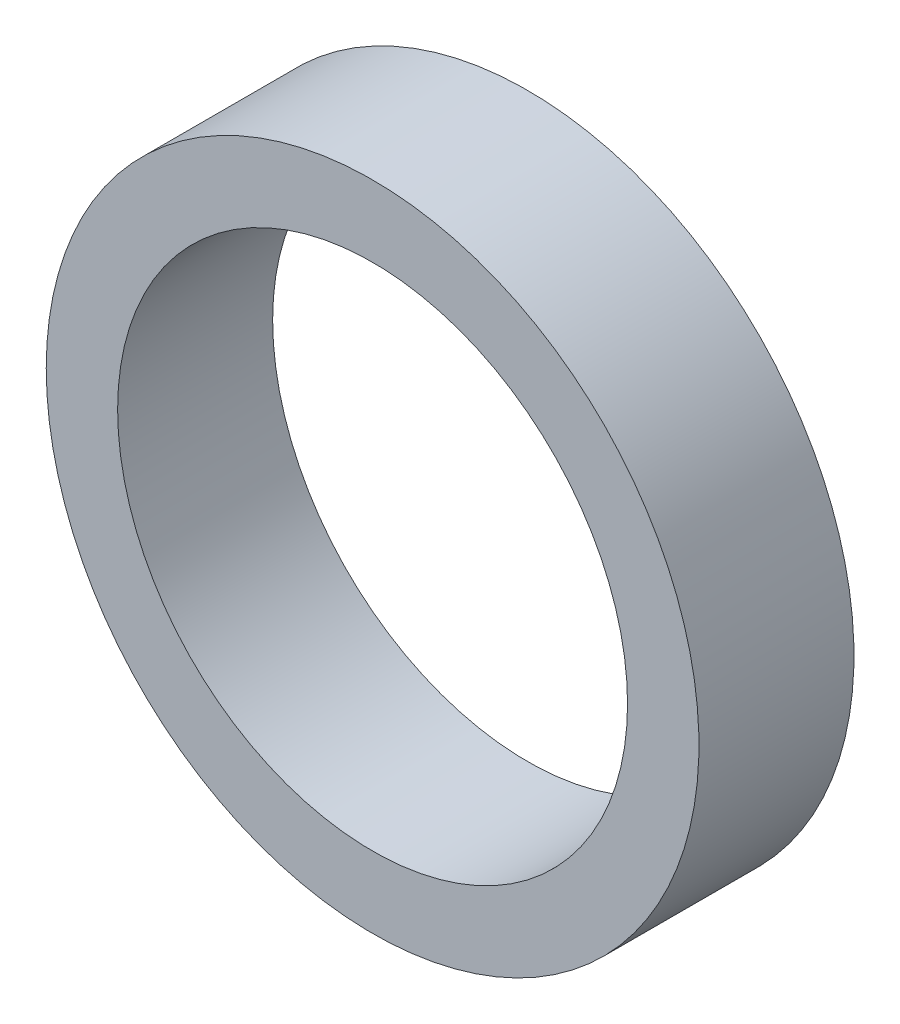
ISO-10303-21;
HEADER;
FILE_DESCRIPTION(('STEP AP214'),'2;1');
FILE_NAME('part.step','',(''),(''),'','','');
FILE_SCHEMA(('AUTOMOTIVE_DESIGN { 1 0 10303 214 1 1 1 1 }'));
ENDSEC;
DATA;
#1=APPLICATION_CONTEXT('core data for automotive mechanical design processes');
#2=APPLICATION_PROTOCOL_DEFINITION('international standard','automotive_design',2000,#1);
#3=PRODUCT_CONTEXT('',#1,'mechanical');
#4=PRODUCT('Part','Part','',(#3));
#5=PRODUCT_RELATED_PRODUCT_CATEGORY('part','',(#4));
#6=PRODUCT_DEFINITION_FORMATION('','',#4);
#7=PRODUCT_DEFINITION_CONTEXT('part definition',#1,'design');
#8=PRODUCT_DEFINITION('design','',#6,#7);
#9=PRODUCT_DEFINITION_SHAPE('','',#8);
#10=(LENGTH_UNIT() NAMED_UNIT(*) SI_UNIT(.MILLI.,.METRE.));
#11=(NAMED_UNIT(*) PLANE_ANGLE_UNIT() SI_UNIT($,.RADIAN.));
#12=(NAMED_UNIT(*) SI_UNIT($,.STERADIAN.) SOLID_ANGLE_UNIT());
#13=UNCERTAINTY_MEASURE_WITH_UNIT(LENGTH_MEASURE(1.E-05),#10,'distance_accuracy_value','');
#14=(GEOMETRIC_REPRESENTATION_CONTEXT(3) GLOBAL_UNCERTAINTY_ASSIGNED_CONTEXT((#13)) GLOBAL_UNIT_ASSIGNED_CONTEXT((#10,
#11,#12)) REPRESENTATION_CONTEXT('',''));
#15=CARTESIAN_POINT('',(0.,0.,0.));
#16=DIRECTION('',(0.,0.,1.));
#17=DIRECTION('',(1.,0.,0.));
#18=AXIS2_PLACEMENT_3D('',#15,#16,#17);
#19=CARTESIAN_POINT('',(0.,0.,7.6));
#20=DIRECTION('',(0.,0.,1.));
#21=DIRECTION('',(1.,0.,0.));
#22=AXIS2_PLACEMENT_3D('',#19,#20,#21);
#23=PLANE('',#22);
#24=CARTESIAN_POINT('',(0.,0.,7.6));
#25=DIRECTION('',(0.,0.,1.));
#26=DIRECTION('',(1.,0.,0.));
#27=AXIS2_PLACEMENT_3D('',#24,#25,#26);
#28=CIRCLE('',#27,16.);
#29=CARTESIAN_POINT('',(-16.,0.,7.6));
#30=VERTEX_POINT('',#29);
#31=EDGE_CURVE('E10',#30,#30,#28,.T.);
#32=ORIENTED_EDGE('',*,*,#31,.T.);
#33=EDGE_LOOP('',(#32));
#34=FACE_BOUND('',#33,.T.);
#35=CARTESIAN_POINT('',(0.,0.,7.6));
#36=DIRECTION('',(0.,0.,1.));
#37=DIRECTION('',(1.,0.,0.));
#38=AXIS2_PLACEMENT_3D('',#35,#36,#37);
#39=CIRCLE('',#38,12.5);
#40=CARTESIAN_POINT('',(-12.5,0.,7.6));
#41=VERTEX_POINT('',#40);
#42=EDGE_CURVE('E43',#41,#41,#39,.T.);
#43=ORIENTED_EDGE('',*,*,#42,.F.);
#44=EDGE_LOOP('',(#43));
#45=FACE_BOUND('',#44,.T.);
#46=ADVANCED_FACE('F32',(#34,#45),#23,.T.);
#47=CARTESIAN_POINT('',(0.,0.,0.));
#48=DIRECTION('',(0.,0.,1.));
#49=DIRECTION('',(1.,0.,0.));
#50=AXIS2_PLACEMENT_3D('',#47,#48,#49);
#51=PLANE('',#50);
#52=CARTESIAN_POINT('',(0.,0.,0.));
#53=DIRECTION('',(0.,0.,1.));
#54=DIRECTION('',(1.,0.,0.));
#55=AXIS2_PLACEMENT_3D('',#52,#53,#54);
#56=CIRCLE('',#55,16.);
#57=CARTESIAN_POINT('',(-16.,0.,0.));
#58=VERTEX_POINT('',#57);
#59=EDGE_CURVE('E36',#58,#58,#56,.T.);
#60=ORIENTED_EDGE('',*,*,#59,.F.);
#61=EDGE_LOOP('',(#60));
#62=FACE_BOUND('',#61,.T.);
#63=CARTESIAN_POINT('',(0.,0.,0.));
#64=DIRECTION('',(0.,0.,1.));
#65=DIRECTION('',(1.,0.,0.));
#66=AXIS2_PLACEMENT_3D('',#63,#64,#65);
#67=CIRCLE('',#66,12.5);
#68=CARTESIAN_POINT('',(-12.5,0.,0.));
#69=VERTEX_POINT('',#68);
#70=EDGE_CURVE('E45',#69,#69,#67,.T.);
#71=ORIENTED_EDGE('',*,*,#70,.T.);
#72=EDGE_LOOP('',(#71));
#73=FACE_BOUND('',#72,.T.);
#74=ADVANCED_FACE('F55',(#62,#73),#51,.F.);
#75=CARTESIAN_POINT('',(0.,0.,7.6));
#76=DIRECTION('',(0.,0.,-1.));
#77=DIRECTION('',(-1.,0.,0.));
#78=AXIS2_PLACEMENT_3D('',#75,#76,#77);
#79=CYLINDRICAL_SURFACE('',#78,16.);
#80=CARTESIAN_POINT('',(-16.,0.,7.6));
#81=CARTESIAN_POINT('',(-16.,0.,7.52083333333333));
#82=CARTESIAN_POINT('',(-16.,0.,7.44166666666667));
#83=CARTESIAN_POINT('',(-16.,0.,7.28333333333333));
#84=CARTESIAN_POINT('',(-16.,0.,7.20416666666667));
#85=CARTESIAN_POINT('',(-16.,0.,7.04583333333333));
#86=CARTESIAN_POINT('',(-16.,0.,6.96666666666667));
#87=CARTESIAN_POINT('',(-16.,0.,6.80833333333333));
#88=CARTESIAN_POINT('',(-16.,0.,6.72916666666667));
#89=CARTESIAN_POINT('',(-16.,0.,6.57083333333333));
#90=CARTESIAN_POINT('',(-16.,0.,6.49166666666667));
#91=CARTESIAN_POINT('',(-16.,0.,6.33333333333333));
#92=CARTESIAN_POINT('',(-16.,0.,6.25416666666667));
#93=CARTESIAN_POINT('',(-16.,0.,6.09583333333333));
#94=CARTESIAN_POINT('',(-16.,0.,6.01666666666667));
#95=CARTESIAN_POINT('',(-16.,0.,5.85833333333333));
#96=CARTESIAN_POINT('',(-16.,0.,5.77916666666667));
#97=CARTESIAN_POINT('',(-16.,0.,5.62083333333333));
#98=CARTESIAN_POINT('',(-16.,0.,5.54166666666667));
#99=CARTESIAN_POINT('',(-16.,0.,5.38333333333333));
#100=CARTESIAN_POINT('',(-16.,0.,5.30416666666667));
#101=CARTESIAN_POINT('',(-16.,0.,5.14583333333333));
#102=CARTESIAN_POINT('',(-16.,0.,5.06666666666667));
#103=CARTESIAN_POINT('',(-16.,0.,4.90833333333333));
#104=CARTESIAN_POINT('',(-16.,0.,4.82916666666667));
#105=CARTESIAN_POINT('',(-16.,0.,4.67083333333333));
#106=CARTESIAN_POINT('',(-16.,0.,4.59166666666667));
#107=CARTESIAN_POINT('',(-16.,0.,4.43333333333333));
#108=CARTESIAN_POINT('',(-16.,0.,4.35416666666667));
#109=CARTESIAN_POINT('',(-16.,0.,4.19583333333333));
#110=CARTESIAN_POINT('',(-16.,0.,4.11666666666667));
#111=CARTESIAN_POINT('',(-16.,0.,3.95833333333333));
#112=CARTESIAN_POINT('',(-16.,0.,3.87916666666667));
#113=CARTESIAN_POINT('',(-16.,0.,3.72083333333333));
#114=CARTESIAN_POINT('',(-16.,0.,3.64166666666667));
#115=CARTESIAN_POINT('',(-16.,0.,3.48333333333333));
#116=CARTESIAN_POINT('',(-16.,0.,3.40416666666667));
#117=CARTESIAN_POINT('',(-16.,0.,3.24583333333333));
#118=CARTESIAN_POINT('',(-16.,0.,3.16666666666667));
#119=CARTESIAN_POINT('',(-16.,0.,3.00833333333333));
#120=CARTESIAN_POINT('',(-16.,0.,2.92916666666667));
#121=CARTESIAN_POINT('',(-16.,0.,2.77083333333333));
#122=CARTESIAN_POINT('',(-16.,0.,2.69166666666667));
#123=CARTESIAN_POINT('',(-16.,0.,2.53333333333333));
#124=CARTESIAN_POINT('',(-16.,0.,2.45416666666667));
#125=CARTESIAN_POINT('',(-16.,0.,2.29583333333333));
#126=CARTESIAN_POINT('',(-16.,0.,2.21666666666667));
#127=CARTESIAN_POINT('',(-16.,0.,2.05833333333333));
#128=CARTESIAN_POINT('',(-16.,0.,1.97916666666667));
#129=CARTESIAN_POINT('',(-16.,0.,1.82083333333333));
#130=CARTESIAN_POINT('',(-16.,0.,1.74166666666667));
#131=CARTESIAN_POINT('',(-16.,0.,1.58333333333333));
#132=CARTESIAN_POINT('',(-16.,0.,1.50416666666667));
#133=CARTESIAN_POINT('',(-16.,0.,1.34583333333333));
#134=CARTESIAN_POINT('',(-16.,0.,1.26666666666667));
#135=CARTESIAN_POINT('',(-16.,0.,1.10833333333333));
#136=CARTESIAN_POINT('',(-16.,0.,1.02916666666667));
#137=CARTESIAN_POINT('',(-16.,0.,0.870833333333333));
#138=CARTESIAN_POINT('',(-16.,0.,0.791666666666667));
#139=CARTESIAN_POINT('',(-16.,0.,0.633333333333333));
#140=CARTESIAN_POINT('',(-16.,0.,0.554166666666666));
#141=CARTESIAN_POINT('',(-16.,0.,0.395833333333333));
#142=CARTESIAN_POINT('',(-16.,0.,0.316666666666667));
#143=CARTESIAN_POINT('',(-16.,0.,0.158333333333333));
#144=CARTESIAN_POINT('',(-16.,0.,0.0791666666666665));
#145=CARTESIAN_POINT('',(-16.,0.,0.));
#146=B_SPLINE_CURVE_WITH_KNOTS('',3,(#80,#81,#82,#83,#84,#85,#86,#87,#88,#89,#90,#91,#92,#93,
#94,#95,#96,#97,#98,#99,#100,#101,#102,#103,#104,#105,#106,#107,#108,#109,#110,#111,#112,#113,
#114,#115,#116,#117,#118,#119,#120,#121,#122,#123,#124,#125,#126,#127,#128,#129,#130,#131,#132,
#133,#134,#135,#136,#137,#138,#139,#140,#141,#142,#143,#144,#145),.UNSPECIFIED.,.F.,.F.,(4,2,2,
2,2,2,2,2,2,2,2,2,2,2,2,2,2,2,2,2,2,2,2,2,2,2,2,2,2,2,2,2,4),(0.,0.2375,0.475,0.7125,0.95,
1.1875,1.425,1.6625,1.9,2.1375,2.375,2.6125,2.85,3.0875,3.325,3.5625,3.8,4.0375,4.275,4.5125,
4.75,4.9875,5.225,5.4625,5.7,5.9375,6.175,6.4125,6.65,6.8875,7.125,7.3625,7.6),.UNSPECIFIED.);
#147=EDGE_CURVE('BSEAM34',#30,#58,#146,.T.);
#148=ORIENTED_EDGE('',*,*,#31,.F.);
#149=ORIENTED_EDGE('',*,*,#59,.T.);
#150=ORIENTED_EDGE('',*,*,#147,.T.);
#151=ORIENTED_EDGE('',*,*,#147,.F.);
#152=EDGE_LOOP('',(#148,#150,#149,#151));
#153=FACE_BOUND('',#152,.T.);
#154=ADVANCED_FACE('F34',(#153),#79,.T.);
#155=CARTESIAN_POINT('',(0.,0.,7.6));
#156=DIRECTION('',(0.,0.,-1.));
#157=DIRECTION('',(-1.,0.,0.));
#158=AXIS2_PLACEMENT_3D('',#155,#156,#157);
#159=CYLINDRICAL_SURFACE('',#158,12.5);
#160=CARTESIAN_POINT('',(-12.5,0.,7.6));
#161=CARTESIAN_POINT('',(-12.5,0.,7.52083333333333));
#162=CARTESIAN_POINT('',(-12.5,0.,7.44166666666667));
#163=CARTESIAN_POINT('',(-12.5,0.,7.28333333333333));
#164=CARTESIAN_POINT('',(-12.5,0.,7.20416666666667));
#165=CARTESIAN_POINT('',(-12.5,0.,7.04583333333333));
#166=CARTESIAN_POINT('',(-12.5,0.,6.96666666666667));
#167=CARTESIAN_POINT('',(-12.5,0.,6.80833333333333));
#168=CARTESIAN_POINT('',(-12.5,0.,6.72916666666667));
#169=CARTESIAN_POINT('',(-12.5,0.,6.57083333333333));
#170=CARTESIAN_POINT('',(-12.5,0.,6.49166666666667));
#171=CARTESIAN_POINT('',(-12.5,0.,6.33333333333333));
#172=CARTESIAN_POINT('',(-12.5,0.,6.25416666666667));
#173=CARTESIAN_POINT('',(-12.5,0.,6.09583333333333));
#174=CARTESIAN_POINT('',(-12.5,0.,6.01666666666667));
#175=CARTESIAN_POINT('',(-12.5,0.,5.85833333333333));
#176=CARTESIAN_POINT('',(-12.5,0.,5.77916666666667));
#177=CARTESIAN_POINT('',(-12.5,0.,5.62083333333333));
#178=CARTESIAN_POINT('',(-12.5,0.,5.54166666666667));
#179=CARTESIAN_POINT('',(-12.5,0.,5.38333333333333));
#180=CARTESIAN_POINT('',(-12.5,0.,5.30416666666667));
#181=CARTESIAN_POINT('',(-12.5,0.,5.14583333333333));
#182=CARTESIAN_POINT('',(-12.5,0.,5.06666666666667));
#183=CARTESIAN_POINT('',(-12.5,0.,4.90833333333333));
#184=CARTESIAN_POINT('',(-12.5,0.,4.82916666666667));
#185=CARTESIAN_POINT('',(-12.5,0.,4.67083333333333));
#186=CARTESIAN_POINT('',(-12.5,0.,4.59166666666667));
#187=CARTESIAN_POINT('',(-12.5,0.,4.43333333333333));
#188=CARTESIAN_POINT('',(-12.5,0.,4.35416666666667));
#189=CARTESIAN_POINT('',(-12.5,0.,4.19583333333333));
#190=CARTESIAN_POINT('',(-12.5,0.,4.11666666666667));
#191=CARTESIAN_POINT('',(-12.5,0.,3.95833333333333));
#192=CARTESIAN_POINT('',(-12.5,0.,3.87916666666667));
#193=CARTESIAN_POINT('',(-12.5,0.,3.72083333333333));
#194=CARTESIAN_POINT('',(-12.5,0.,3.64166666666667));
#195=CARTESIAN_POINT('',(-12.5,0.,3.48333333333333));
#196=CARTESIAN_POINT('',(-12.5,0.,3.40416666666667));
#197=CARTESIAN_POINT('',(-12.5,0.,3.24583333333333));
#198=CARTESIAN_POINT('',(-12.5,0.,3.16666666666667));
#199=CARTESIAN_POINT('',(-12.5,0.,3.00833333333333));
#200=CARTESIAN_POINT('',(-12.5,0.,2.92916666666667));
#201=CARTESIAN_POINT('',(-12.5,0.,2.77083333333333));
#202=CARTESIAN_POINT('',(-12.5,0.,2.69166666666667));
#203=CARTESIAN_POINT('',(-12.5,0.,2.53333333333333));
#204=CARTESIAN_POINT('',(-12.5,0.,2.45416666666667));
#205=CARTESIAN_POINT('',(-12.5,0.,2.29583333333333));
#206=CARTESIAN_POINT('',(-12.5,0.,2.21666666666667));
#207=CARTESIAN_POINT('',(-12.5,0.,2.05833333333333));
#208=CARTESIAN_POINT('',(-12.5,0.,1.97916666666667));
#209=CARTESIAN_POINT('',(-12.5,0.,1.82083333333333));
#210=CARTESIAN_POINT('',(-12.5,0.,1.74166666666667));
#211=CARTESIAN_POINT('',(-12.5,0.,1.58333333333333));
#212=CARTESIAN_POINT('',(-12.5,0.,1.50416666666667));
#213=CARTESIAN_POINT('',(-12.5,0.,1.34583333333333));
#214=CARTESIAN_POINT('',(-12.5,0.,1.26666666666667));
#215=CARTESIAN_POINT('',(-12.5,0.,1.10833333333333));
#216=CARTESIAN_POINT('',(-12.5,0.,1.02916666666667));
#217=CARTESIAN_POINT('',(-12.5,0.,0.870833333333334));
#218=CARTESIAN_POINT('',(-12.5,0.,0.791666666666667));
#219=CARTESIAN_POINT('',(-12.5,0.,0.633333333333334));
#220=CARTESIAN_POINT('',(-12.5,0.,0.554166666666667));
#221=CARTESIAN_POINT('',(-12.5,0.,0.395833333333333));
#222=CARTESIAN_POINT('',(-12.5,0.,0.316666666666666));
#223=CARTESIAN_POINT('',(-12.5,0.,0.158333333333333));
#224=CARTESIAN_POINT('',(-12.5,0.,0.0791666666666666));
#225=CARTESIAN_POINT('',(-12.5,0.,0.));
#226=B_SPLINE_CURVE_WITH_KNOTS('',3,(#160,#161,#162,#163,#164,#165,#166,#167,#168,#169,#170,
#171,#172,#173,#174,#175,#176,#177,#178,#179,#180,#181,#182,#183,#184,#185,#186,#187,#188,#189,
#190,#191,#192,#193,#194,#195,#196,#197,#198,#199,#200,#201,#202,#203,#204,#205,#206,#207,#208,
#209,#210,#211,#212,#213,#214,#215,#216,#217,#218,#219,#220,#221,#222,#223,#224,#225),
.UNSPECIFIED.,.F.,.F.,(4,2,2,2,2,2,2,2,2,2,2,2,2,2,2,2,2,2,2,2,2,2,2,2,2,2,2,2,2,2,2,2,4),(0.,
0.237500000000001,0.475000000000001,0.7125,0.95,1.1875,1.425,1.6625,1.9,2.1375,2.375,2.6125,
2.85,3.0875,3.325,3.5625,3.8,4.0375,4.275,4.5125,4.75,4.9875,5.225,5.4625,5.7,5.9375,6.175,
6.4125,6.65,6.8875,7.125,7.3625,7.6),.UNSPECIFIED.);
#227=EDGE_CURVE('BSEAM51',#41,#69,#226,.T.);
#228=ORIENTED_EDGE('',*,*,#42,.T.);
#229=ORIENTED_EDGE('',*,*,#70,.F.);
#230=ORIENTED_EDGE('',*,*,#227,.T.);
#231=ORIENTED_EDGE('',*,*,#227,.F.);
#232=EDGE_LOOP('',(#228,#230,#229,#231));
#233=FACE_BOUND('',#232,.T.);
#234=ADVANCED_FACE('F51',(#233),#159,.F.);
#235=CLOSED_SHELL('',(#46,#74,#154,#234));
#236=MANIFOLD_SOLID_BREP('B2',#235);
#237=ADVANCED_BREP_SHAPE_REPRESENTATION('',(#18,#236),#14);
#238=SHAPE_DEFINITION_REPRESENTATION(#9,#237);
ENDSEC;
END-ISO-10303-21;
